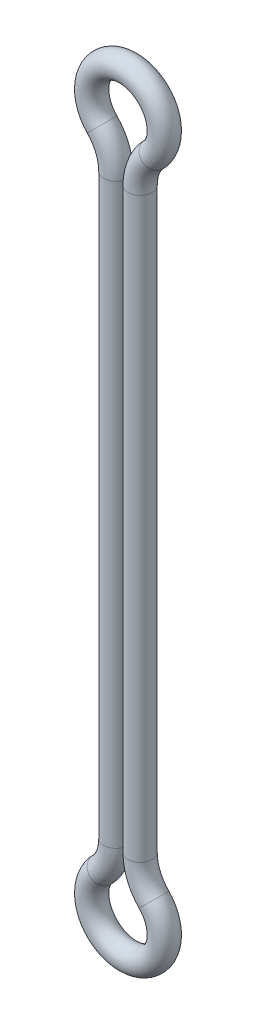
ISO-10303-21;
HEADER;
FILE_DESCRIPTION(('STEP AP214'),'2;1');
FILE_NAME('part.step','',(''),(''),'','','');
FILE_SCHEMA(('AUTOMOTIVE_DESIGN { 1 0 10303 214 1 1 1 1 }'));
ENDSEC;
DATA;
#1=APPLICATION_CONTEXT('core data for automotive mechanical design processes');
#2=APPLICATION_PROTOCOL_DEFINITION('international standard','automotive_design',2000,#1);
#3=PRODUCT_CONTEXT('',#1,'mechanical');
#4=PRODUCT('Part','Part','',(#3));
#5=PRODUCT_RELATED_PRODUCT_CATEGORY('part','',(#4));
#6=PRODUCT_DEFINITION_FORMATION('','',#4);
#7=PRODUCT_DEFINITION_CONTEXT('part definition',#1,'design');
#8=PRODUCT_DEFINITION('design','',#6,#7);
#9=PRODUCT_DEFINITION_SHAPE('','',#8);
#10=(LENGTH_UNIT() NAMED_UNIT(*) SI_UNIT(.MILLI.,.METRE.));
#11=(NAMED_UNIT(*) PLANE_ANGLE_UNIT() SI_UNIT($,.RADIAN.));
#12=(NAMED_UNIT(*) SI_UNIT($,.STERADIAN.) SOLID_ANGLE_UNIT());
#13=UNCERTAINTY_MEASURE_WITH_UNIT(LENGTH_MEASURE(1.E-05),#10,'distance_accuracy_value','');
#14=(GEOMETRIC_REPRESENTATION_CONTEXT(3) GLOBAL_UNCERTAINTY_ASSIGNED_CONTEXT((#13)) GLOBAL_UNIT_ASSIGNED_CONTEXT((#10,
#11,#12)) REPRESENTATION_CONTEXT('',''));
#15=CARTESIAN_POINT('',(0.,0.,0.));
#16=DIRECTION('',(0.,0.,1.));
#17=DIRECTION('',(1.,0.,0.));
#18=AXIS2_PLACEMENT_3D('',#15,#16,#17);
#19=CARTESIAN_POINT('',(-7.99999999999999,9.79795897113271,0.));
#20=DIRECTION('',(0.,0.,1.));
#21=DIRECTION('',(1.,0.,0.));
#22=AXIS2_PLACEMENT_3D('',#19,#20,#21);
#23=TOROIDAL_SURFACE('',#22,7.99999999999997,2.);
#24=CARTESIAN_POINT('',(-2.28571428571417,4.19912527334274,0.));
#25=DIRECTION('',(0.699854212223787,0.714285714285693,0.));
#26=DIRECTION('',(0.,0.,1.));
#27=AXIS2_PLACEMENT_3D('',#24,#25,#26);
#28=CIRCLE('',#27,2.);
#29=CARTESIAN_POINT('',(-0.857142857142707,2.79941684889525,0.));
#30=VERTEX_POINT('',#29);
#31=EDGE_CURVE('E37',#30,#30,#28,.T.);
#32=CARTESIAN_POINT('',(0.,9.79795897113289,0.));
#33=DIRECTION('',(0.,1.,0.));
#34=DIRECTION('',(0.,0.,1.));
#35=AXIS2_PLACEMENT_3D('',#32,#33,#34);
#36=CIRCLE('',#35,2.);
#37=CARTESIAN_POINT('',(1.99999999999998,9.79795897113294,0.));
#38=VERTEX_POINT('',#37);
#39=EDGE_CURVE('E10',#38,#38,#36,.T.);
#40=CARTESIAN_POINT('',(-7.99999999999999,9.79795897113271,0.));
#41=DIRECTION('',(0.,0.,1.));
#42=DIRECTION('',(1.,0.,0.));
#43=AXIS2_PLACEMENT_3D('',#40,#41,#42);
#44=CIRCLE('',#43,9.99999999999997);
#45=EDGE_CURVE('',#30,#38,#44,.T.);
#46=ORIENTED_EDGE('',*,*,#31,.T.);
#47=ORIENTED_EDGE('',*,*,#39,.F.);
#48=ORIENTED_EDGE('',*,*,#45,.T.);
#49=ORIENTED_EDGE('',*,*,#45,.F.);
#50=EDGE_LOOP('',(#46,#48,#47,#49));
#51=FACE_BOUND('',#50,.T.);
#52=ADVANCED_FACE('F31',(#51),#23,.T.);
#53=CARTESIAN_POINT('',(2.00000000000001,0.,0.));
#54=DIRECTION('',(0.,0.,-1.));
#55=DIRECTION('',(-1.,0.,0.));
#56=AXIS2_PLACEMENT_3D('',#53,#54,#55);
#57=TOROIDAL_SURFACE('',#56,6.00000000000002,2.);
#58=CARTESIAN_POINT('',(6.28571428571438,4.19912527334254,0.));
#59=DIRECTION('',(0.699854212223754,-0.714285714285725,0.));
#60=DIRECTION('',(0.,0.,1.));
#61=AXIS2_PLACEMENT_3D('',#58,#59,#60);
#62=CIRCLE('',#61,2.);
#63=CARTESIAN_POINT('',(4.85714285714297,2.79941684889499,0.));
#64=VERTEX_POINT('',#63);
#65=EDGE_CURVE('E41',#64,#64,#62,.T.);
#66=ORIENTED_EDGE('',*,*,#65,.T.);
#67=EDGE_LOOP('',(#66));
#68=FACE_BOUND('',#67,.T.);
#69=ORIENTED_EDGE('',*,*,#31,.F.);
#70=EDGE_LOOP('',(#69));
#71=FACE_BOUND('',#70,.T.);
#72=ADVANCED_FACE('F75',(#68,#71),#57,.T.);
#73=CARTESIAN_POINT('',(12.,9.79795897113272,0.));
#74=DIRECTION('',(0.,0.,1.));
#75=DIRECTION('',(1.,0.,0.));
#76=AXIS2_PLACEMENT_3D('',#73,#74,#75);
#77=TOROIDAL_SURFACE('',#76,7.99999999999998,2.);
#78=CARTESIAN_POINT('',(4.00000000000003,9.79795897113261,0.));
#79=DIRECTION('',(0.,-1.,0.));
#80=DIRECTION('',(0.,0.,1.));
#81=AXIS2_PLACEMENT_3D('',#78,#79,#80);
#82=CIRCLE('',#81,2.);
#83=CARTESIAN_POINT('',(2.00000000000003,9.79795897113259,0.));
#84=VERTEX_POINT('',#83);
#85=EDGE_CURVE('E45',#84,#84,#82,.T.);
#86=CARTESIAN_POINT('',(12.,9.79795897113272,0.));
#87=DIRECTION('',(0.,0.,1.));
#88=DIRECTION('',(1.,0.,0.));
#89=AXIS2_PLACEMENT_3D('',#86,#87,#88);
#90=CIRCLE('',#89,9.99999999999998);
#91=EDGE_CURVE('',#84,#64,#90,.T.);
#92=ORIENTED_EDGE('',*,*,#85,.T.);
#93=ORIENTED_EDGE('',*,*,#65,.F.);
#94=ORIENTED_EDGE('',*,*,#91,.T.);
#95=ORIENTED_EDGE('',*,*,#91,.F.);
#96=EDGE_LOOP('',(#92,#94,#93,#95));
#97=FACE_BOUND('',#96,.T.);
#98=ADVANCED_FACE('F79',(#97),#77,.T.);
#99=CARTESIAN_POINT('',(4.00000000000003,105.202041028867,0.));
#100=DIRECTION('',(0.,-1.,0.));
#101=DIRECTION('',(1.,0.,0.));
#102=AXIS2_PLACEMENT_3D('',#99,#100,#101);
#103=CYLINDRICAL_SURFACE('',#102,2.);
#104=CARTESIAN_POINT('',(4.00000000000003,105.202041028867,0.));
#105=DIRECTION('',(0.,-1.,0.));
#106=DIRECTION('',(0.,0.,1.));
#107=AXIS2_PLACEMENT_3D('',#104,#105,#106);
#108=CIRCLE('',#107,2.);
#109=CARTESIAN_POINT('',(2.00000000000003,105.202041028867,0.));
#110=VERTEX_POINT('',#109);
#111=EDGE_CURVE('E50',#110,#110,#108,.T.);
#112=ORIENTED_EDGE('',*,*,#111,.T.);
#113=EDGE_LOOP('',(#112));
#114=FACE_BOUND('',#113,.T.);
#115=ORIENTED_EDGE('',*,*,#85,.F.);
#116=EDGE_LOOP('',(#115));
#117=FACE_BOUND('',#116,.T.);
#118=ADVANCED_FACE('F85',(#114,#117),#103,.T.);
#119=CARTESIAN_POINT('',(12.,105.202041028867,0.));
#120=DIRECTION('',(0.,0.,1.));
#121=DIRECTION('',(1.,0.,0.));
#122=AXIS2_PLACEMENT_3D('',#119,#120,#121);
#123=TOROIDAL_SURFACE('',#122,7.99999999999998,2.);
#124=CARTESIAN_POINT('',(6.28571428571424,110.800874726657,0.));
#125=DIRECTION('',(-0.699854212223776,-0.714285714285704,0.));
#126=DIRECTION('',(0.,0.,1.));
#127=AXIS2_PLACEMENT_3D('',#124,#125,#126);
#128=CIRCLE('',#127,2.);
#129=CARTESIAN_POINT('',(4.8571428571428,112.200583151105,0.));
#130=VERTEX_POINT('',#129);
#131=EDGE_CURVE('E53',#130,#130,#128,.T.);
#132=CARTESIAN_POINT('',(12.,105.202041028867,0.));
#133=DIRECTION('',(0.,0.,1.));
#134=DIRECTION('',(1.,0.,0.));
#135=AXIS2_PLACEMENT_3D('',#132,#133,#134);
#136=CIRCLE('',#135,9.99999999999998);
#137=EDGE_CURVE('',#130,#110,#136,.T.);
#138=ORIENTED_EDGE('',*,*,#131,.T.);
#139=ORIENTED_EDGE('',*,*,#111,.F.);
#140=ORIENTED_EDGE('',*,*,#137,.T.);
#141=ORIENTED_EDGE('',*,*,#137,.F.);
#142=EDGE_LOOP('',(#138,#140,#139,#141));
#143=FACE_BOUND('',#142,.T.);
#144=ADVANCED_FACE('F92',(#143),#123,.T.);
#145=CARTESIAN_POINT('',(2.00000000000001,115.,0.));
#146=DIRECTION('',(0.,0.,-1.));
#147=DIRECTION('',(-1.,0.,0.));
#148=AXIS2_PLACEMENT_3D('',#145,#146,#147);
#149=TOROIDAL_SURFACE('',#148,6.00000000000002,2.);
#150=CARTESIAN_POINT('',(-2.28571428571429,110.800874726657,0.));
#151=DIRECTION('',(-0.699854212223764,0.714285714285715,0.));
#152=DIRECTION('',(0.,0.,1.));
#153=AXIS2_PLACEMENT_3D('',#150,#151,#152);
#154=CIRCLE('',#153,2.);
#155=CARTESIAN_POINT('',(-0.857142857142859,112.200583151105,0.));
#156=VERTEX_POINT('',#155);
#157=EDGE_CURVE('E56',#156,#156,#154,.T.);
#158=ORIENTED_EDGE('',*,*,#157,.T.);
#159=EDGE_LOOP('',(#158));
#160=FACE_BOUND('',#159,.T.);
#161=ORIENTED_EDGE('',*,*,#131,.F.);
#162=EDGE_LOOP('',(#161));
#163=FACE_BOUND('',#162,.T.);
#164=ADVANCED_FACE('F72',(#160,#163),#149,.T.);
#165=CARTESIAN_POINT('',(-8.,105.202041028867,0.));
#166=DIRECTION('',(0.,0.,1.));
#167=DIRECTION('',(1.,0.,0.));
#168=AXIS2_PLACEMENT_3D('',#165,#166,#167);
#169=TOROIDAL_SURFACE('',#168,7.99999999999999,2.);
#170=CARTESIAN_POINT('',(0.,105.202041028867,0.));
#171=DIRECTION('',(0.,1.,0.));
#172=DIRECTION('',(0.,0.,1.));
#173=AXIS2_PLACEMENT_3D('',#170,#171,#172);
#174=CIRCLE('',#173,2.);
#175=CARTESIAN_POINT('',(1.99999999999999,105.202041028867,0.));
#176=VERTEX_POINT('',#175);
#177=EDGE_CURVE('E59',#176,#176,#174,.T.);
#178=CARTESIAN_POINT('',(-8.,105.202041028867,0.));
#179=DIRECTION('',(0.,0.,1.));
#180=DIRECTION('',(1.,0.,0.));
#181=AXIS2_PLACEMENT_3D('',#178,#179,#180);
#182=CIRCLE('',#181,9.99999999999999);
#183=EDGE_CURVE('',#176,#156,#182,.T.);
#184=ORIENTED_EDGE('',*,*,#177,.T.);
#185=ORIENTED_EDGE('',*,*,#157,.F.);
#186=ORIENTED_EDGE('',*,*,#183,.T.);
#187=ORIENTED_EDGE('',*,*,#183,.F.);
#188=EDGE_LOOP('',(#184,#186,#185,#187));
#189=FACE_BOUND('',#188,.T.);
#190=ADVANCED_FACE('F63',(#189),#169,.T.);
#191=CARTESIAN_POINT('',(0.,105.202041028867,0.));
#192=DIRECTION('',(0.,-1.,0.));
#193=DIRECTION('',(1.,0.,0.));
#194=AXIS2_PLACEMENT_3D('',#191,#192,#193);
#195=CYLINDRICAL_SURFACE('',#194,2.);
#196=CARTESIAN_POINT('',(1.99999999999999,105.202041028867,0.));
#197=CARTESIAN_POINT('',(1.99999999999999,104.208248507433,0.));
#198=CARTESIAN_POINT('',(1.99999999999999,103.214455985998,0.));
#199=CARTESIAN_POINT('',(1.99999999999999,101.226870943128,0.));
#200=CARTESIAN_POINT('',(1.99999999999999,100.233078421694,0.));
#201=CARTESIAN_POINT('',(1.99999999999999,98.2454933788241,0.));
#202=CARTESIAN_POINT('',(1.99999999999999,97.2517008573894,0.));
#203=CARTESIAN_POINT('',(1.99999999999999,95.26411581452,0.));
#204=CARTESIAN_POINT('',(1.99999999999999,94.2703232930852,0.));
#205=CARTESIAN_POINT('',(1.99999999999999,92.2827382502157,0.));
#206=CARTESIAN_POINT('',(1.99999999999999,91.288945728781,0.));
#207=CARTESIAN_POINT('',(1.99999999999999,89.3013606859115,0.));
#208=CARTESIAN_POINT('',(1.99999999999999,88.3075681644768,0.));
#209=CARTESIAN_POINT('',(1.99999999999999,86.3199831216073,0.));
#210=CARTESIAN_POINT('',(1.99999999999999,85.3261906001726,0.));
#211=CARTESIAN_POINT('',(1.99999999999999,83.3386055573031,0.));
#212=CARTESIAN_POINT('',(1.99999999999999,82.3448130358684,0.));
#213=CARTESIAN_POINT('',(1.99999999999999,80.3572279929989,0.));
#214=CARTESIAN_POINT('',(1.99999999999999,79.3634354715642,0.));
#215=CARTESIAN_POINT('',(1.99999999999999,77.3758504286947,0.));
#216=CARTESIAN_POINT('',(1.99999999999999,76.38205790726,0.));
#217=CARTESIAN_POINT('',(1.99999999999999,74.3944728643905,0.));
#218=CARTESIAN_POINT('',(1.99999999999999,73.4006803429558,0.));
#219=CARTESIAN_POINT('',(1.99999999999999,71.4130953000863,0.));
#220=CARTESIAN_POINT('',(1.99999999999999,70.4193027786516,0.));
#221=CARTESIAN_POINT('',(1.99999999999999,68.4317177357821,0.));
#222=CARTESIAN_POINT('',(1.99999999999999,67.4379252143474,0.));
#223=CARTESIAN_POINT('',(1.99999999999999,65.4503401714779,0.));
#224=CARTESIAN_POINT('',(1.99999999999999,64.4565476500432,0.));
#225=CARTESIAN_POINT('',(1.99999999999999,62.4689626071737,0.));
#226=CARTESIAN_POINT('',(1.99999999999999,61.475170085739,0.));
#227=CARTESIAN_POINT('',(1.99999999999999,59.4875850428695,0.));
#228=CARTESIAN_POINT('',(1.99999999999999,58.4937925214348,0.));
#229=CARTESIAN_POINT('',(1.99999999999999,56.5062074785653,0.));
#230=CARTESIAN_POINT('',(1.99999999999999,55.5124149571306,0.));
#231=CARTESIAN_POINT('',(1.99999999999999,53.5248299142611,0.));
#232=CARTESIAN_POINT('',(1.99999999999999,52.5310373928264,0.));
#233=CARTESIAN_POINT('',(1.99999999999999,50.5434523499569,0.));
#234=CARTESIAN_POINT('',(2.,49.5496598285222,0.));
#235=CARTESIAN_POINT('',(2.,47.5620747856527,0.));
#236=CARTESIAN_POINT('',(2.,46.568282264218,0.));
#237=CARTESIAN_POINT('',(2.,44.5806972213485,0.));
#238=CARTESIAN_POINT('',(2.,43.5869046999138,0.));
#239=CARTESIAN_POINT('',(2.,41.5993196570443,0.));
#240=CARTESIAN_POINT('',(2.,40.6055271356096,0.));
#241=CARTESIAN_POINT('',(2.,38.6179420927401,0.));
#242=CARTESIAN_POINT('',(2.,37.6241495713054,0.));
#243=CARTESIAN_POINT('',(2.,35.6365645284359,0.));
#244=CARTESIAN_POINT('',(2.,34.6427720070012,0.));
#245=CARTESIAN_POINT('',(2.,32.6551869641317,0.));
#246=CARTESIAN_POINT('',(2.,31.661394442697,0.));
#247=CARTESIAN_POINT('',(2.,29.6738093998275,0.));
#248=CARTESIAN_POINT('',(2.,28.6800168783928,0.));
#249=CARTESIAN_POINT('',(2.,26.6924318355233,0.));
#250=CARTESIAN_POINT('',(2.,25.6986393140886,0.));
#251=CARTESIAN_POINT('',(2.,23.7110542712191,0.));
#252=CARTESIAN_POINT('',(2.,22.7172617497844,0.));
#253=CARTESIAN_POINT('',(2.,20.7296767069149,0.));
#254=CARTESIAN_POINT('',(2.,19.7358841854802,0.));
#255=CARTESIAN_POINT('',(2.,17.7482991426107,0.));
#256=CARTESIAN_POINT('',(2.,16.754506621176,0.));
#257=CARTESIAN_POINT('',(2.,14.7669215783065,0.));
#258=CARTESIAN_POINT('',(2.,13.7731290568718,0.));
#259=CARTESIAN_POINT('',(2.,11.7855440140023,0.));
#260=CARTESIAN_POINT('',(2.,10.7917514925676,0.));
#261=CARTESIAN_POINT('',(2.,9.79795897113282,0.));
#262=B_SPLINE_CURVE_WITH_KNOTS('',3,(#196,#197,#198,#199,#200,#201,#202,#203,#204,#205,#206,
#207,#208,#209,#210,#211,#212,#213,#214,#215,#216,#217,#218,#219,#220,#221,#222,#223,#224,#225,
#226,#227,#228,#229,#230,#231,#232,#233,#234,#235,#236,#237,#238,#239,#240,#241,#242,#243,#244,
#245,#246,#247,#248,#249,#250,#251,#252,#253,#254,#255,#256,#257,#258,#259,#260,#261),
.UNSPECIFIED.,.F.,.F.,(4,2,2,2,2,2,2,2,2,2,2,2,2,2,2,2,2,2,2,2,2,2,2,2,2,2,2,2,2,2,2,2,4),(0.,
2.98137756430419,5.9627551286084,8.9441326929126,11.9255102572168,14.906887821521,
17.8882653858252,20.8696429501294,23.8510205144336,26.8323980787378,29.813775643042,
32.7951532073462,35.7765307716504,38.7579083359546,41.7392859002588,44.720663464563,
47.7020410288672,50.6834185931714,53.6647961574756,56.6461737217798,59.627551286084,
62.6089288503882,65.5903064146924,68.5716839789966,71.5530615433008,74.534439107605,
77.5158166719092,80.4971942362134,83.4785718005177,86.4599493648219,89.441326929126,
92.4227044934302,95.4040820577345),.UNSPECIFIED.);
#263=EDGE_CURVE('BSEAM66',#176,#38,#262,.T.);
#264=ORIENTED_EDGE('',*,*,#177,.F.);
#265=ORIENTED_EDGE('',*,*,#39,.T.);
#266=ORIENTED_EDGE('',*,*,#263,.T.);
#267=ORIENTED_EDGE('',*,*,#263,.F.);
#268=EDGE_LOOP('',(#264,#266,#265,#267));
#269=FACE_BOUND('',#268,.T.);
#270=ADVANCED_FACE('F66',(#269),#195,.T.);
#271=CLOSED_SHELL('',(#52,#72,#98,#118,#144,#164,#190,#270));
#272=MANIFOLD_SOLID_BREP('B2',#271);
#273=ADVANCED_BREP_SHAPE_REPRESENTATION('',(#18,#272),#14);
#274=SHAPE_DEFINITION_REPRESENTATION(#9,#273);
ENDSEC;
END-ISO-10303-21;
